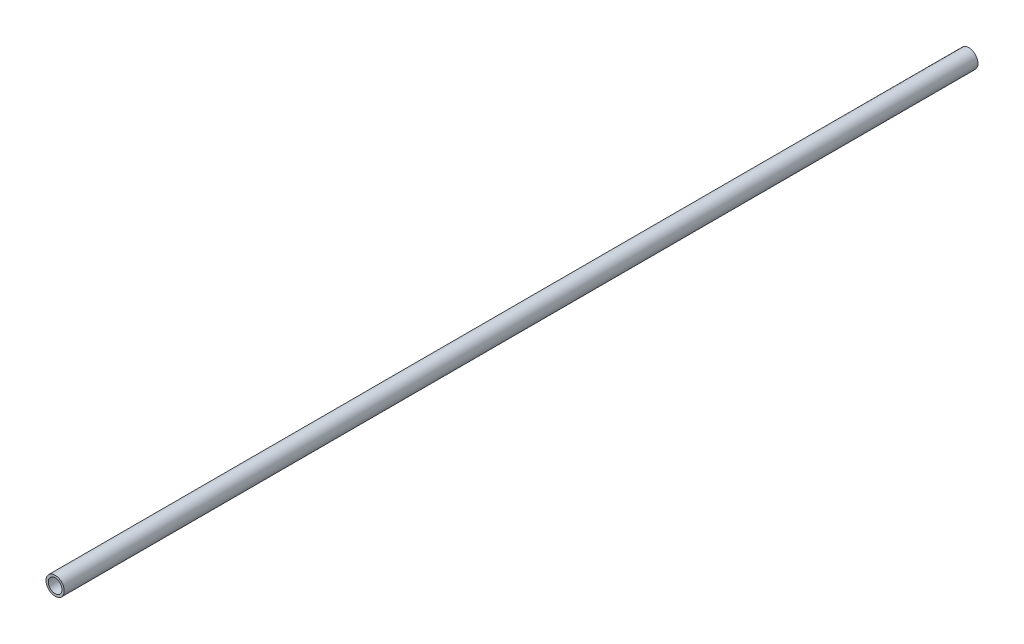
ISO-10303-21;
HEADER;
FILE_DESCRIPTION(('STEP AP214'),'2;1');
FILE_NAME('part.step','',(''),(''),'','','');
FILE_SCHEMA(('AUTOMOTIVE_DESIGN { 1 0 10303 214 1 1 1 1 }'));
ENDSEC;
DATA;
#1=APPLICATION_CONTEXT('core data for automotive mechanical design processes');
#2=APPLICATION_PROTOCOL_DEFINITION('international standard','automotive_design',2000,#1);
#3=PRODUCT_CONTEXT('',#1,'mechanical');
#4=PRODUCT('Part','Part','',(#3));
#5=PRODUCT_RELATED_PRODUCT_CATEGORY('part','',(#4));
#6=PRODUCT_DEFINITION_FORMATION('','',#4);
#7=PRODUCT_DEFINITION_CONTEXT('part definition',#1,'design');
#8=PRODUCT_DEFINITION('design','',#6,#7);
#9=PRODUCT_DEFINITION_SHAPE('','',#8);
#10=(LENGTH_UNIT() NAMED_UNIT(*) SI_UNIT(.MILLI.,.METRE.));
#11=(NAMED_UNIT(*) PLANE_ANGLE_UNIT() SI_UNIT($,.RADIAN.));
#12=(NAMED_UNIT(*) SI_UNIT($,.STERADIAN.) SOLID_ANGLE_UNIT());
#13=UNCERTAINTY_MEASURE_WITH_UNIT(LENGTH_MEASURE(1.E-05),#10,'distance_accuracy_value','');
#14=(GEOMETRIC_REPRESENTATION_CONTEXT(3) GLOBAL_UNCERTAINTY_ASSIGNED_CONTEXT((#13)) GLOBAL_UNIT_ASSIGNED_CONTEXT((#10,
#11,#12)) REPRESENTATION_CONTEXT('',''));
#15=CARTESIAN_POINT('',(0.,0.,0.));
#16=DIRECTION('',(0.,0.,1.));
#17=DIRECTION('',(1.,0.,0.));
#18=AXIS2_PLACEMENT_3D('',#15,#16,#17);
#19=CARTESIAN_POINT('',(0.,0.,1000.));
#20=DIRECTION('',(0.,0.,1.));
#21=DIRECTION('',(1.,0.,0.));
#22=AXIS2_PLACEMENT_3D('',#19,#20,#21);
#23=PLANE('',#22);
#24=CARTESIAN_POINT('',(0.,0.,1000.));
#25=DIRECTION('',(0.,0.,1.));
#26=DIRECTION('',(1.,0.,0.));
#27=AXIS2_PLACEMENT_3D('',#24,#25,#26);
#28=CIRCLE('',#27,10.);
#29=CARTESIAN_POINT('',(10.,0.,1000.));
#30=VERTEX_POINT('',#29);
#31=EDGE_CURVE('E10',#30,#30,#28,.T.);
#32=ORIENTED_EDGE('',*,*,#31,.T.);
#33=EDGE_LOOP('',(#32));
#34=FACE_BOUND('',#33,.T.);
#35=CARTESIAN_POINT('',(0.,0.,1000.));
#36=DIRECTION('',(0.,0.,1.));
#37=DIRECTION('',(1.,0.,0.));
#38=AXIS2_PLACEMENT_3D('',#35,#36,#37);
#39=CIRCLE('',#38,7.5);
#40=CARTESIAN_POINT('',(7.5,0.,1000.));
#41=VERTEX_POINT('',#40);
#42=EDGE_CURVE('E50',#41,#41,#39,.T.);
#43=ORIENTED_EDGE('',*,*,#42,.F.);
#44=EDGE_LOOP('',(#43));
#45=FACE_BOUND('',#44,.T.);
#46=ADVANCED_FACE('F39',(#34,#45),#23,.T.);
#47=CARTESIAN_POINT('',(0.,0.,0.));
#48=DIRECTION('',(0.,0.,1.));
#49=DIRECTION('',(1.,0.,0.));
#50=AXIS2_PLACEMENT_3D('',#47,#48,#49);
#51=PLANE('',#50);
#52=CARTESIAN_POINT('',(0.,0.,0.));
#53=DIRECTION('',(0.,0.,1.));
#54=DIRECTION('',(1.,0.,0.));
#55=AXIS2_PLACEMENT_3D('',#52,#53,#54);
#56=CIRCLE('',#55,10.);
#57=CARTESIAN_POINT('',(10.,0.,0.));
#58=VERTEX_POINT('',#57);
#59=EDGE_CURVE('E43',#58,#58,#56,.T.);
#60=ORIENTED_EDGE('',*,*,#59,.F.);
#61=EDGE_LOOP('',(#60));
#62=FACE_BOUND('',#61,.T.);
#63=CARTESIAN_POINT('',(0.,0.,0.));
#64=DIRECTION('',(0.,0.,1.));
#65=DIRECTION('',(1.,0.,0.));
#66=AXIS2_PLACEMENT_3D('',#63,#64,#65);
#67=CIRCLE('',#66,7.5);
#68=CARTESIAN_POINT('',(7.5,0.,0.));
#69=VERTEX_POINT('',#68);
#70=EDGE_CURVE('E52',#69,#69,#67,.T.);
#71=ORIENTED_EDGE('',*,*,#70,.T.);
#72=EDGE_LOOP('',(#71));
#73=FACE_BOUND('',#72,.T.);
#74=ADVANCED_FACE('F62',(#62,#73),#51,.F.);
#75=CARTESIAN_POINT('',(0.,0.,1000.));
#76=DIRECTION('',(0.,0.,-1.));
#77=DIRECTION('',(-1.,0.,0.));
#78=AXIS2_PLACEMENT_3D('',#75,#76,#77);
#79=CYLINDRICAL_SURFACE('',#78,10.);
#80=ORIENTED_EDGE('',*,*,#31,.F.);
#81=EDGE_LOOP('',(#80));
#82=FACE_BOUND('',#81,.T.);
#83=ORIENTED_EDGE('',*,*,#59,.T.);
#84=EDGE_LOOP('',(#83));
#85=FACE_BOUND('',#84,.T.);
#86=ADVANCED_FACE('F41',(#82,#85),#79,.T.);
#87=CARTESIAN_POINT('',(0.,0.,1000.));
#88=DIRECTION('',(0.,0.,-1.));
#89=DIRECTION('',(-1.,0.,0.));
#90=AXIS2_PLACEMENT_3D('',#87,#88,#89);
#91=CYLINDRICAL_SURFACE('',#90,7.5);
#92=ORIENTED_EDGE('',*,*,#42,.T.);
#93=EDGE_LOOP('',(#92));
#94=FACE_BOUND('',#93,.T.);
#95=ORIENTED_EDGE('',*,*,#70,.F.);
#96=EDGE_LOOP('',(#95));
#97=FACE_BOUND('',#96,.T.);
#98=ADVANCED_FACE('F58',(#94,#97),#91,.F.);
#99=CLOSED_SHELL('',(#46,#74,#86,#98));
#100=MANIFOLD_SOLID_BREP('B2',#99);
#101=ADVANCED_BREP_SHAPE_REPRESENTATION('',(#18,#100),#14);
#102=SHAPE_DEFINITION_REPRESENTATION(#9,#101);
ENDSEC;
END-ISO-10303-21;
